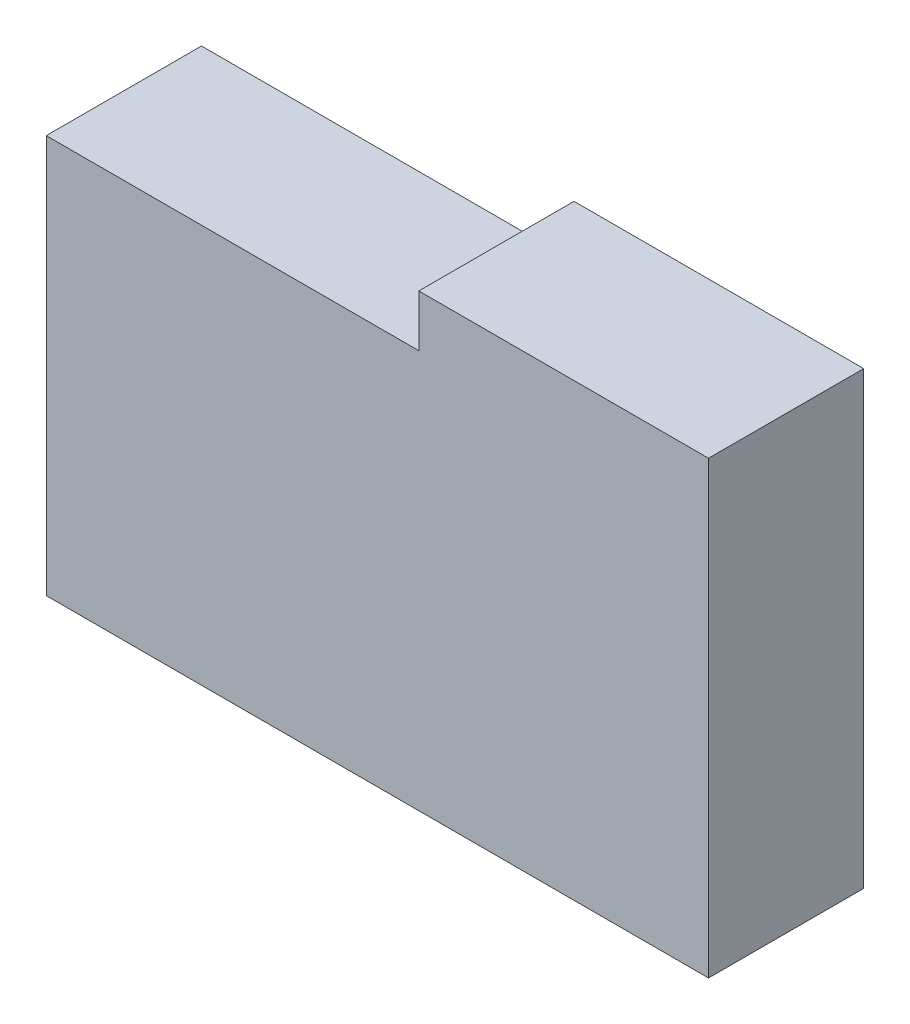
ISO-10303-21;
HEADER;
FILE_DESCRIPTION(('STEP AP214'),'2;1');
FILE_NAME('part.step','',(''),(''),'','','');
FILE_SCHEMA(('AUTOMOTIVE_DESIGN { 1 0 10303 214 1 1 1 1 }'));
ENDSEC;
DATA;
#1=APPLICATION_CONTEXT('core data for automotive mechanical design processes');
#2=APPLICATION_PROTOCOL_DEFINITION('international standard','automotive_design',2000,#1);
#3=PRODUCT_CONTEXT('',#1,'mechanical');
#4=PRODUCT('Part','Part','',(#3));
#5=PRODUCT_RELATED_PRODUCT_CATEGORY('part','',(#4));
#6=PRODUCT_DEFINITION_FORMATION('','',#4);
#7=PRODUCT_DEFINITION_CONTEXT('part definition',#1,'design');
#8=PRODUCT_DEFINITION('design','',#6,#7);
#9=PRODUCT_DEFINITION_SHAPE('','',#8);
#10=(LENGTH_UNIT() NAMED_UNIT(*) SI_UNIT(.MILLI.,.METRE.));
#11=(NAMED_UNIT(*) PLANE_ANGLE_UNIT() SI_UNIT($,.RADIAN.));
#12=(NAMED_UNIT(*) SI_UNIT($,.STERADIAN.) SOLID_ANGLE_UNIT());
#13=UNCERTAINTY_MEASURE_WITH_UNIT(LENGTH_MEASURE(1.E-05),#10,'distance_accuracy_value','');
#14=(GEOMETRIC_REPRESENTATION_CONTEXT(3) GLOBAL_UNCERTAINTY_ASSIGNED_CONTEXT((#13)) GLOBAL_UNIT_ASSIGNED_CONTEXT((#10,
#11,#12)) REPRESENTATION_CONTEXT('',''));
#15=CARTESIAN_POINT('',(0.,0.,0.));
#16=DIRECTION('',(0.,0.,1.));
#17=DIRECTION('',(1.,0.,0.));
#18=AXIS2_PLACEMENT_3D('',#15,#16,#17);
#19=CARTESIAN_POINT('',(0.,77.,-30.));
#20=DIRECTION('',(-1.,0.,0.));
#21=DIRECTION('',(0.,-1.,0.));
#22=AXIS2_PLACEMENT_3D('',#19,#20,#21);
#23=PLANE('',#22);
#24=DIRECTION('',(0.,-1.,0.));
#25=VECTOR('',#24,1.);
#26=CARTESIAN_POINT('',(0.,77.,0.));
#27=LINE('',#26,#25);
#28=CARTESIAN_POINT('',(0.,77.,0.));
#29=VERTEX_POINT('',#28);
#30=CARTESIAN_POINT('',(0.,0.,0.));
#31=VERTEX_POINT('',#30);
#32=EDGE_CURVE('E130',#29,#31,#27,.T.);
#33=ORIENTED_EDGE('',*,*,#32,.F.);
#34=DIRECTION('',(0.,0.,1.));
#35=VECTOR('',#34,1.);
#36=CARTESIAN_POINT('',(0.,77.,-30.));
#37=LINE('',#36,#35);
#38=CARTESIAN_POINT('',(0.,77.,-30.));
#39=VERTEX_POINT('',#38);
#40=EDGE_CURVE('E11',#39,#29,#37,.T.);
#41=ORIENTED_EDGE('',*,*,#40,.F.);
#42=DIRECTION('',(0.,-1.,0.));
#43=VECTOR('',#42,1.);
#44=CARTESIAN_POINT('',(0.,77.,-30.));
#45=LINE('',#44,#43);
#46=CARTESIAN_POINT('',(0.,0.,-30.));
#47=VERTEX_POINT('',#46);
#48=EDGE_CURVE('E150',#39,#47,#45,.T.);
#49=ORIENTED_EDGE('',*,*,#48,.T.);
#50=DIRECTION('',(0.,0.,1.));
#51=VECTOR('',#50,1.);
#52=CARTESIAN_POINT('',(0.,0.,-30.));
#53=LINE('',#52,#51);
#54=EDGE_CURVE('E42',#47,#31,#53,.T.);
#55=ORIENTED_EDGE('',*,*,#54,.T.);
#56=EDGE_LOOP('',(#33,#41,#49,#55));
#57=FACE_BOUND('',#56,.T.);
#58=ADVANCED_FACE('F39',(#57),#23,.T.);
#59=CARTESIAN_POINT('',(72.,77.,-30.));
#60=DIRECTION('',(0.,1.,0.));
#61=DIRECTION('',(-1.,0.,0.));
#62=AXIS2_PLACEMENT_3D('',#59,#60,#61);
#63=PLANE('',#62);
#64=DIRECTION('',(-1.,0.,0.));
#65=VECTOR('',#64,1.);
#66=CARTESIAN_POINT('',(72.,77.,0.));
#67=LINE('',#66,#65);
#68=CARTESIAN_POINT('',(72.,77.,0.));
#69=VERTEX_POINT('',#68);
#70=EDGE_CURVE('E147',#69,#29,#67,.T.);
#71=ORIENTED_EDGE('',*,*,#70,.F.);
#72=DIRECTION('',(0.,0.,1.));
#73=VECTOR('',#72,1.);
#74=CARTESIAN_POINT('',(72.,77.,-30.));
#75=LINE('',#74,#73);
#76=CARTESIAN_POINT('',(72.,77.,-30.));
#77=VERTEX_POINT('',#76);
#78=EDGE_CURVE('E49',#77,#69,#75,.T.);
#79=ORIENTED_EDGE('',*,*,#78,.F.);
#80=DIRECTION('',(-1.,0.,0.));
#81=VECTOR('',#80,1.);
#82=CARTESIAN_POINT('',(72.,77.,-30.));
#83=LINE('',#82,#81);
#84=EDGE_CURVE('E116',#77,#39,#83,.T.);
#85=ORIENTED_EDGE('',*,*,#84,.T.);
#86=ORIENTED_EDGE('',*,*,#40,.T.);
#87=EDGE_LOOP('',(#71,#79,#85,#86));
#88=FACE_BOUND('',#87,.T.);
#89=ADVANCED_FACE('F162',(#88),#63,.T.);
#90=CARTESIAN_POINT('',(72.,87.,-30.));
#91=DIRECTION('',(-1.,0.,0.));
#92=DIRECTION('',(0.,0.,1.));
#93=AXIS2_PLACEMENT_3D('',#90,#91,#92);
#94=PLANE('',#93);
#95=DIRECTION('',(0.,-1.,0.));
#96=VECTOR('',#95,1.);
#97=CARTESIAN_POINT('',(72.,87.,0.));
#98=LINE('',#97,#96);
#99=CARTESIAN_POINT('',(72.,87.,0.));
#100=VERTEX_POINT('',#99);
#101=EDGE_CURVE('E102',#100,#69,#98,.T.);
#102=ORIENTED_EDGE('',*,*,#101,.F.);
#103=DIRECTION('',(0.,0.,1.));
#104=VECTOR('',#103,1.);
#105=CARTESIAN_POINT('',(72.,87.,-30.));
#106=LINE('',#105,#104);
#107=CARTESIAN_POINT('',(72.,87.,-30.));
#108=VERTEX_POINT('',#107);
#109=EDGE_CURVE('E97',#108,#100,#106,.T.);
#110=ORIENTED_EDGE('',*,*,#109,.F.);
#111=DIRECTION('',(0.,-1.,0.));
#112=VECTOR('',#111,1.);
#113=CARTESIAN_POINT('',(72.,87.,-30.));
#114=LINE('',#113,#112);
#115=EDGE_CURVE('E100',#108,#77,#114,.T.);
#116=ORIENTED_EDGE('',*,*,#115,.T.);
#117=ORIENTED_EDGE('',*,*,#78,.T.);
#118=EDGE_LOOP('',(#102,#110,#116,#117));
#119=FACE_BOUND('',#118,.T.);
#120=ADVANCED_FACE('F99',(#119),#94,.T.);
#121=CARTESIAN_POINT('',(128.,87.,-30.));
#122=DIRECTION('',(0.,1.,0.));
#123=DIRECTION('',(-1.,0.,0.));
#124=AXIS2_PLACEMENT_3D('',#121,#122,#123);
#125=PLANE('',#124);
#126=DIRECTION('',(-1.,0.,0.));
#127=VECTOR('',#126,1.);
#128=CARTESIAN_POINT('',(128.,87.,0.));
#129=LINE('',#128,#127);
#130=CARTESIAN_POINT('',(128.,87.,0.));
#131=VERTEX_POINT('',#130);
#132=EDGE_CURVE('E142',#131,#100,#129,.T.);
#133=ORIENTED_EDGE('',*,*,#132,.F.);
#134=DIRECTION('',(0.,0.,1.));
#135=VECTOR('',#134,1.);
#136=CARTESIAN_POINT('',(128.,87.,-30.));
#137=LINE('',#136,#135);
#138=CARTESIAN_POINT('',(128.,87.,-30.));
#139=VERTEX_POINT('',#138);
#140=EDGE_CURVE('E108',#139,#131,#137,.T.);
#141=ORIENTED_EDGE('',*,*,#140,.F.);
#142=DIRECTION('',(-1.,0.,0.));
#143=VECTOR('',#142,1.);
#144=CARTESIAN_POINT('',(128.,87.,-30.));
#145=LINE('',#144,#143);
#146=EDGE_CURVE('E114',#139,#108,#145,.T.);
#147=ORIENTED_EDGE('',*,*,#146,.T.);
#148=ORIENTED_EDGE('',*,*,#109,.T.);
#149=EDGE_LOOP('',(#133,#141,#147,#148));
#150=FACE_BOUND('',#149,.T.);
#151=ADVANCED_FACE('F119',(#150),#125,.T.);
#152=CARTESIAN_POINT('',(128.,0.,-30.));
#153=DIRECTION('',(1.,0.,0.));
#154=DIRECTION('',(0.,0.,-1.));
#155=AXIS2_PLACEMENT_3D('',#152,#153,#154);
#156=PLANE('',#155);
#157=DIRECTION('',(0.,1.,0.));
#158=VECTOR('',#157,1.);
#159=CARTESIAN_POINT('',(128.,0.,0.));
#160=LINE('',#159,#158);
#161=CARTESIAN_POINT('',(128.,0.,0.));
#162=VERTEX_POINT('',#161);
#163=EDGE_CURVE('E138',#162,#131,#160,.T.);
#164=ORIENTED_EDGE('',*,*,#163,.F.);
#165=DIRECTION('',(0.,0.,1.));
#166=VECTOR('',#165,1.);
#167=CARTESIAN_POINT('',(128.,0.,-30.));
#168=LINE('',#167,#166);
#169=CARTESIAN_POINT('',(128.,0.,-30.));
#170=VERTEX_POINT('',#169);
#171=EDGE_CURVE('E155',#170,#162,#168,.T.);
#172=ORIENTED_EDGE('',*,*,#171,.F.);
#173=DIRECTION('',(0.,1.,0.));
#174=VECTOR('',#173,1.);
#175=CARTESIAN_POINT('',(128.,0.,-30.));
#176=LINE('',#175,#174);
#177=EDGE_CURVE('E121',#170,#139,#176,.T.);
#178=ORIENTED_EDGE('',*,*,#177,.T.);
#179=ORIENTED_EDGE('',*,*,#140,.T.);
#180=EDGE_LOOP('',(#164,#172,#178,#179));
#181=FACE_BOUND('',#180,.T.);
#182=ADVANCED_FACE('F175',(#181),#156,.T.);
#183=CARTESIAN_POINT('',(0.,0.,-30.));
#184=DIRECTION('',(0.,-1.,0.));
#185=DIRECTION('',(0.,0.,-1.));
#186=AXIS2_PLACEMENT_3D('',#183,#184,#185);
#187=PLANE('',#186);
#188=DIRECTION('',(1.,0.,0.));
#189=VECTOR('',#188,1.);
#190=CARTESIAN_POINT('',(0.,0.,0.));
#191=LINE('',#190,#189);
#192=EDGE_CURVE('E134',#31,#162,#191,.T.);
#193=ORIENTED_EDGE('',*,*,#192,.F.);
#194=ORIENTED_EDGE('',*,*,#54,.F.);
#195=DIRECTION('',(1.,0.,0.));
#196=VECTOR('',#195,1.);
#197=CARTESIAN_POINT('',(0.,0.,-30.));
#198=LINE('',#197,#196);
#199=EDGE_CURVE('E124',#47,#170,#198,.T.);
#200=ORIENTED_EDGE('',*,*,#199,.T.);
#201=ORIENTED_EDGE('',*,*,#171,.T.);
#202=EDGE_LOOP('',(#193,#194,#200,#201));
#203=FACE_BOUND('',#202,.T.);
#204=ADVANCED_FACE('F159',(#203),#187,.T.);
#205=CARTESIAN_POINT('',(0.,0.,-30.));
#206=DIRECTION('',(0.,0.,1.));
#207=DIRECTION('',(1.,0.,0.));
#208=AXIS2_PLACEMENT_3D('',#205,#206,#207);
#209=PLANE('',#208);
#210=ORIENTED_EDGE('',*,*,#48,.F.);
#211=ORIENTED_EDGE('',*,*,#84,.F.);
#212=ORIENTED_EDGE('',*,*,#115,.F.);
#213=ORIENTED_EDGE('',*,*,#146,.F.);
#214=ORIENTED_EDGE('',*,*,#177,.F.);
#215=ORIENTED_EDGE('',*,*,#199,.F.);
#216=EDGE_LOOP('',(#210,#211,#212,#213,#214,#215));
#217=FACE_BOUND('',#216,.T.);
#218=ADVANCED_FACE('F112',(#217),#209,.F.);
#219=CARTESIAN_POINT('',(0.,0.,0.));
#220=DIRECTION('',(0.,0.,1.));
#221=DIRECTION('',(1.,0.,0.));
#222=AXIS2_PLACEMENT_3D('',#219,#220,#221);
#223=PLANE('',#222);
#224=ORIENTED_EDGE('',*,*,#32,.T.);
#225=ORIENTED_EDGE('',*,*,#192,.T.);
#226=ORIENTED_EDGE('',*,*,#163,.T.);
#227=ORIENTED_EDGE('',*,*,#132,.T.);
#228=ORIENTED_EDGE('',*,*,#101,.T.);
#229=ORIENTED_EDGE('',*,*,#70,.T.);
#230=EDGE_LOOP('',(#224,#225,#226,#227,#228,#229));
#231=FACE_BOUND('',#230,.T.);
#232=ADVANCED_FACE('F161',(#231),#223,.T.);
#233=CLOSED_SHELL('',(#58,#89,#120,#151,#182,#204,#218,#232));
#234=MANIFOLD_SOLID_BREP('B2',#233);
#235=ADVANCED_BREP_SHAPE_REPRESENTATION('',(#18,#234),#14);
#236=SHAPE_DEFINITION_REPRESENTATION(#9,#235);
ENDSEC;
END-ISO-10303-21;
